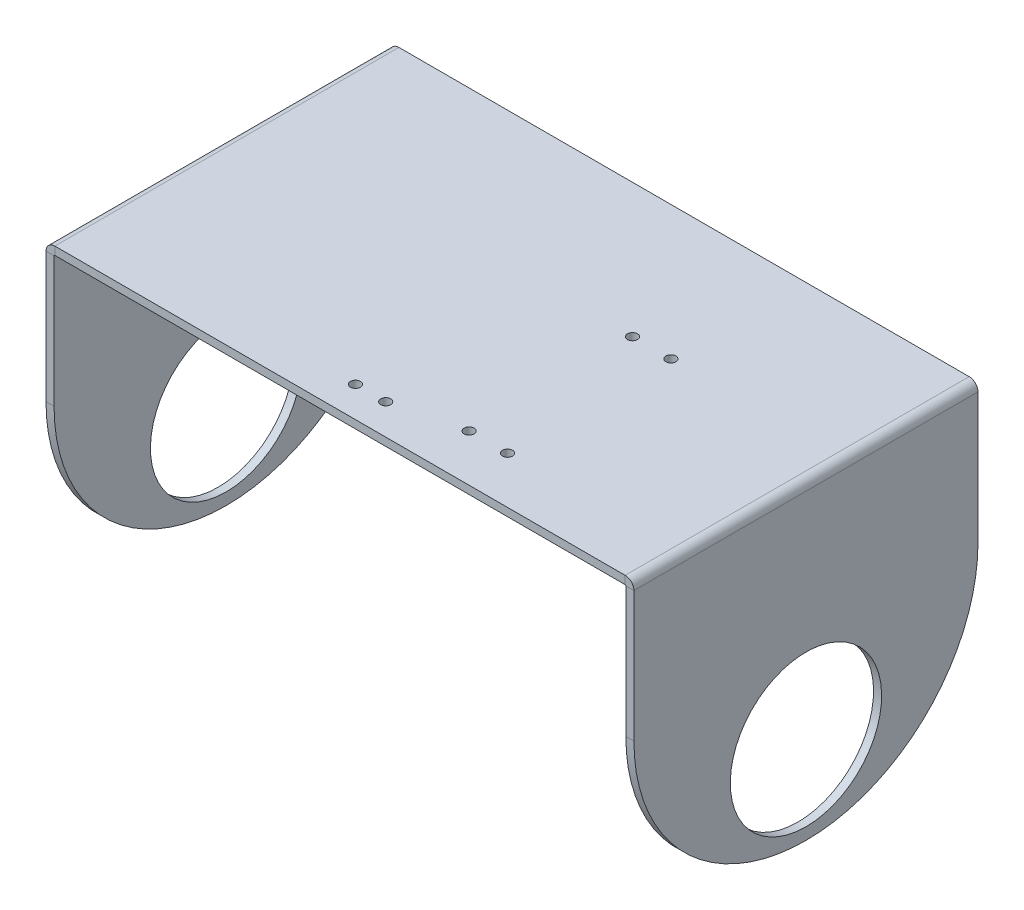
ISO-10303-21;
HEADER;
FILE_DESCRIPTION(('STEP AP214'),'2;1');
FILE_NAME('part.step','',(''),(''),'','','');
FILE_SCHEMA(('AUTOMOTIVE_DESIGN { 1 0 10303 214 1 1 1 1 }'));
ENDSEC;
DATA;
#1=APPLICATION_CONTEXT('core data for automotive mechanical design processes');
#2=APPLICATION_PROTOCOL_DEFINITION('international standard','automotive_design',2000,#1);
#3=PRODUCT_CONTEXT('',#1,'mechanical');
#4=PRODUCT('Part','Part','',(#3));
#5=PRODUCT_RELATED_PRODUCT_CATEGORY('part','',(#4));
#6=PRODUCT_DEFINITION_FORMATION('','',#4);
#7=PRODUCT_DEFINITION_CONTEXT('part definition',#1,'design');
#8=PRODUCT_DEFINITION('design','',#6,#7);
#9=PRODUCT_DEFINITION_SHAPE('','',#8);
#10=(LENGTH_UNIT() NAMED_UNIT(*) SI_UNIT(.MILLI.,.METRE.));
#11=(NAMED_UNIT(*) PLANE_ANGLE_UNIT() SI_UNIT($,.RADIAN.));
#12=(NAMED_UNIT(*) SI_UNIT($,.STERADIAN.) SOLID_ANGLE_UNIT());
#13=UNCERTAINTY_MEASURE_WITH_UNIT(LENGTH_MEASURE(1.E-05),#10,'distance_accuracy_value','');
#14=(GEOMETRIC_REPRESENTATION_CONTEXT(3) GLOBAL_UNCERTAINTY_ASSIGNED_CONTEXT((#13)) GLOBAL_UNIT_ASSIGNED_CONTEXT((#10,
#11,#12)) REPRESENTATION_CONTEXT('',''));
#15=CARTESIAN_POINT('',(0.,0.,0.));
#16=DIRECTION('',(0.,0.,1.));
#17=DIRECTION('',(1.,0.,0.));
#18=AXIS2_PLACEMENT_3D('',#15,#16,#17);
#19=CARTESIAN_POINT('',(0.,-8.,0.));
#20=DIRECTION('',(0.,-1.,0.));
#21=DIRECTION('',(0.,0.,-1.));
#22=AXIS2_PLACEMENT_3D('',#19,#20,#21);
#23=PLANE('',#22);
#24=CARTESIAN_POINT('',(410.94,-8.,-208.49));
#25=DIRECTION('',(0.,-1.,0.));
#26=DIRECTION('',(0.,0.,-1.));
#27=AXIS2_PLACEMENT_3D('',#24,#25,#26);
#28=CIRCLE('',#27,4.99999999999998);
#29=CARTESIAN_POINT('',(410.94,-8.,-213.49));
#30=VERTEX_POINT('',#29);
#31=EDGE_CURVE('E335',#30,#30,#28,.T.);
#32=ORIENTED_EDGE('',*,*,#31,.F.);
#33=EDGE_LOOP('',(#32));
#34=FACE_BOUND('',#33,.T.);
#35=CARTESIAN_POINT('',(372.86,-8.,-208.49));
#36=DIRECTION('',(0.,-1.,0.));
#37=DIRECTION('',(0.,0.,-1.));
#38=AXIS2_PLACEMENT_3D('',#35,#36,#37);
#39=CIRCLE('',#38,4.99999999999998);
#40=CARTESIAN_POINT('',(372.86,-8.,-213.49));
#41=VERTEX_POINT('',#40);
#42=EDGE_CURVE('E329',#41,#41,#39,.T.);
#43=ORIENTED_EDGE('',*,*,#42,.F.);
#44=EDGE_LOOP('',(#43));
#45=FACE_BOUND('',#44,.T.);
#46=CARTESIAN_POINT('',(372.86,-8.,-46.56));
#47=DIRECTION('',(0.,-1.,0.));
#48=DIRECTION('',(0.,0.,-1.));
#49=AXIS2_PLACEMENT_3D('',#46,#47,#48);
#50=CIRCLE('',#49,4.99999999999998);
#51=CARTESIAN_POINT('',(372.86,-8.,-51.56));
#52=VERTEX_POINT('',#51);
#53=EDGE_CURVE('E83',#52,#52,#50,.T.);
#54=ORIENTED_EDGE('',*,*,#53,.F.);
#55=EDGE_LOOP('',(#54));
#56=FACE_BOUND('',#55,.T.);
#57=CARTESIAN_POINT('',(410.94,-8.,-46.56));
#58=DIRECTION('',(0.,-1.,0.));
#59=DIRECTION('',(0.,0.,-1.));
#60=AXIS2_PLACEMENT_3D('',#57,#58,#59);
#61=CIRCLE('',#60,4.99999999999998);
#62=CARTESIAN_POINT('',(410.94,-8.,-51.56));
#63=VERTEX_POINT('',#62);
#64=EDGE_CURVE('E316',#63,#63,#61,.T.);
#65=ORIENTED_EDGE('',*,*,#64,.F.);
#66=EDGE_LOOP('',(#65));
#67=FACE_BOUND('',#66,.T.);
#68=CARTESIAN_POINT('',(306.4,-8.,-30.31));
#69=DIRECTION('',(0.,-1.,0.));
#70=DIRECTION('',(0.,0.,-1.));
#71=AXIS2_PLACEMENT_3D('',#68,#69,#70);
#72=CIRCLE('',#71,4.99999999999998);
#73=CARTESIAN_POINT('',(306.4,-8.,-35.31));
#74=VERTEX_POINT('',#73);
#75=EDGE_CURVE('E207',#74,#74,#72,.T.);
#76=ORIENTED_EDGE('',*,*,#75,.F.);
#77=EDGE_LOOP('',(#76));
#78=FACE_BOUND('',#77,.T.);
#79=CARTESIAN_POINT('',(276.4,-8.,-30.31));
#80=DIRECTION('',(0.,-1.,0.));
#81=DIRECTION('',(0.,0.,-1.));
#82=AXIS2_PLACEMENT_3D('',#79,#80,#81);
#83=CIRCLE('',#82,4.99999999999998);
#84=CARTESIAN_POINT('',(276.4,-8.,-35.31));
#85=VERTEX_POINT('',#84);
#86=EDGE_CURVE('E213',#85,#85,#83,.T.);
#87=ORIENTED_EDGE('',*,*,#86,.F.);
#88=EDGE_LOOP('',(#87));
#89=FACE_BOUND('',#88,.T.);
#90=DIRECTION('',(-1.,0.,0.));
#91=VECTOR('',#90,1.);
#92=CARTESIAN_POINT('',(0.,-8.,-341.07));
#93=LINE('',#92,#91);
#94=CARTESIAN_POINT('',(574.0634,-8.00000000000001,-341.07));
#95=VERTEX_POINT('',#94);
#96=CARTESIAN_POINT('',(8.7366,-8.,-341.07));
#97=VERTEX_POINT('',#96);
#98=EDGE_CURVE('E13',#95,#97,#93,.T.);
#99=ORIENTED_EDGE('',*,*,#98,.F.);
#100=DIRECTION('',(0.,0.,1.));
#101=VECTOR('',#100,1.);
#102=CARTESIAN_POINT('',(574.0634,-8.00000000000001,0.));
#103=LINE('',#102,#101);
#104=CARTESIAN_POINT('',(574.0634,-8.00000000000001,0.));
#105=VERTEX_POINT('',#104);
#106=EDGE_CURVE('E247',#105,#95,#103,.F.);
#107=ORIENTED_EDGE('',*,*,#106,.F.);
#108=DIRECTION('',(1.,0.,0.));
#109=VECTOR('',#108,1.);
#110=CARTESIAN_POINT('',(0.,-8.,0.));
#111=LINE('',#110,#109);
#112=CARTESIAN_POINT('',(8.7366,-8.,0.));
#113=VERTEX_POINT('',#112);
#114=EDGE_CURVE('E88',#113,#105,#111,.T.);
#115=ORIENTED_EDGE('',*,*,#114,.F.);
#116=DIRECTION('',(0.,0.,-1.));
#117=VECTOR('',#116,1.);
#118=CARTESIAN_POINT('',(8.7366,-8.,-341.07));
#119=LINE('',#118,#117);
#120=EDGE_CURVE('E296',#97,#113,#119,.F.);
#121=ORIENTED_EDGE('',*,*,#120,.F.);
#122=EDGE_LOOP('',(#99,#107,#115,#121));
#123=FACE_BOUND('',#122,.T.);
#124=ADVANCED_FACE('F79',(#34,#45,#56,#67,#78,#89,#123),#23,.T.);
#125=CARTESIAN_POINT('',(0.,0.,0.));
#126=DIRECTION('',(0.,-1.,0.));
#127=DIRECTION('',(0.,0.,-1.));
#128=AXIS2_PLACEMENT_3D('',#125,#126,#127);
#129=PLANE('',#128);
#130=CARTESIAN_POINT('',(410.94,0.,-208.49));
#131=DIRECTION('',(0.,1.,0.));
#132=DIRECTION('',(0.,0.,1.));
#133=AXIS2_PLACEMENT_3D('',#130,#131,#132);
#134=CIRCLE('',#133,5.);
#135=CARTESIAN_POINT('',(410.94,0.,-203.49));
#136=VERTEX_POINT('',#135);
#137=EDGE_CURVE('E338',#136,#136,#134,.T.);
#138=ORIENTED_EDGE('',*,*,#137,.F.);
#139=EDGE_LOOP('',(#138));
#140=FACE_BOUND('',#139,.T.);
#141=CARTESIAN_POINT('',(372.86,0.,-208.49));
#142=DIRECTION('',(0.,1.,0.));
#143=DIRECTION('',(0.,0.,1.));
#144=AXIS2_PLACEMENT_3D('',#141,#142,#143);
#145=CIRCLE('',#144,5.);
#146=CARTESIAN_POINT('',(372.86,0.,-203.49));
#147=VERTEX_POINT('',#146);
#148=EDGE_CURVE('E332',#147,#147,#145,.T.);
#149=ORIENTED_EDGE('',*,*,#148,.F.);
#150=EDGE_LOOP('',(#149));
#151=FACE_BOUND('',#150,.T.);
#152=CARTESIAN_POINT('',(372.86,0.,-46.56));
#153=DIRECTION('',(0.,1.,0.));
#154=DIRECTION('',(0.,0.,1.));
#155=AXIS2_PLACEMENT_3D('',#152,#153,#154);
#156=CIRCLE('',#155,5.);
#157=CARTESIAN_POINT('',(372.86,0.,-41.56));
#158=VERTEX_POINT('',#157);
#159=EDGE_CURVE('E326',#158,#158,#156,.T.);
#160=ORIENTED_EDGE('',*,*,#159,.F.);
#161=EDGE_LOOP('',(#160));
#162=FACE_BOUND('',#161,.T.);
#163=CARTESIAN_POINT('',(410.94,0.,-46.56));
#164=DIRECTION('',(0.,1.,0.));
#165=DIRECTION('',(0.,0.,1.));
#166=AXIS2_PLACEMENT_3D('',#163,#164,#165);
#167=CIRCLE('',#166,5.);
#168=CARTESIAN_POINT('',(410.94,0.,-41.56));
#169=VERTEX_POINT('',#168);
#170=EDGE_CURVE('E321',#169,#169,#167,.T.);
#171=ORIENTED_EDGE('',*,*,#170,.F.);
#172=EDGE_LOOP('',(#171));
#173=FACE_BOUND('',#172,.T.);
#174=CARTESIAN_POINT('',(306.4,0.,-30.31));
#175=DIRECTION('',(0.,1.,0.));
#176=DIRECTION('',(0.,0.,1.));
#177=AXIS2_PLACEMENT_3D('',#174,#175,#176);
#178=CIRCLE('',#177,5.);
#179=CARTESIAN_POINT('',(306.4,0.,-25.31));
#180=VERTEX_POINT('',#179);
#181=EDGE_CURVE('E199',#180,#180,#178,.T.);
#182=ORIENTED_EDGE('',*,*,#181,.F.);
#183=EDGE_LOOP('',(#182));
#184=FACE_BOUND('',#183,.T.);
#185=CARTESIAN_POINT('',(276.4,0.,-30.31));
#186=DIRECTION('',(0.,1.,0.));
#187=DIRECTION('',(0.,0.,1.));
#188=AXIS2_PLACEMENT_3D('',#185,#186,#187);
#189=CIRCLE('',#188,5.);
#190=CARTESIAN_POINT('',(276.4,0.,-25.31));
#191=VERTEX_POINT('',#190);
#192=EDGE_CURVE('E210',#191,#191,#189,.T.);
#193=ORIENTED_EDGE('',*,*,#192,.F.);
#194=EDGE_LOOP('',(#193));
#195=FACE_BOUND('',#194,.T.);
#196=DIRECTION('',(0.,0.,1.));
#197=VECTOR('',#196,1.);
#198=CARTESIAN_POINT('',(574.0634,0.,0.));
#199=LINE('',#198,#197);
#200=CARTESIAN_POINT('',(574.0634,0.,0.));
#201=VERTEX_POINT('',#200);
#202=CARTESIAN_POINT('',(574.0634,0.,-341.07));
#203=VERTEX_POINT('',#202);
#204=EDGE_CURVE('E235',#201,#203,#199,.F.);
#205=ORIENTED_EDGE('',*,*,#204,.T.);
#206=DIRECTION('',(-1.,0.,0.));
#207=VECTOR('',#206,1.);
#208=CARTESIAN_POINT('',(0.,0.,-341.07));
#209=LINE('',#208,#207);
#210=CARTESIAN_POINT('',(8.7366,0.,-341.07));
#211=VERTEX_POINT('',#210);
#212=EDGE_CURVE('E304',#203,#211,#209,.T.);
#213=ORIENTED_EDGE('',*,*,#212,.T.);
#214=DIRECTION('',(0.,0.,-1.));
#215=VECTOR('',#214,1.);
#216=CARTESIAN_POINT('',(8.7366,0.,-341.07));
#217=LINE('',#216,#215);
#218=CARTESIAN_POINT('',(8.7366,0.,0.));
#219=VERTEX_POINT('',#218);
#220=EDGE_CURVE('E284',#211,#219,#217,.F.);
#221=ORIENTED_EDGE('',*,*,#220,.T.);
#222=DIRECTION('',(1.,0.,0.));
#223=VECTOR('',#222,1.);
#224=CARTESIAN_POINT('',(0.,0.,0.));
#225=LINE('',#224,#223);
#226=EDGE_CURVE('E302',#219,#201,#225,.T.);
#227=ORIENTED_EDGE('',*,*,#226,.T.);
#228=EDGE_LOOP('',(#205,#213,#221,#227));
#229=FACE_BOUND('',#228,.T.);
#230=ADVANCED_FACE('F344',(#140,#151,#162,#173,#184,#195,#229),#129,.F.);
#231=CARTESIAN_POINT('',(0.,-8.,0.));
#232=DIRECTION('',(0.,0.,1.));
#233=DIRECTION('',(1.,0.,0.));
#234=AXIS2_PLACEMENT_3D('',#231,#232,#233);
#235=PLANE('',#234);
#236=ORIENTED_EDGE('',*,*,#114,.T.);
#237=DIRECTION('',(0.,1.,0.));
#238=VECTOR('',#237,1.);
#239=CARTESIAN_POINT('',(574.0634,-8.00000000000001,0.));
#240=LINE('',#239,#238);
#241=EDGE_CURVE('E241',#105,#201,#240,.T.);
#242=ORIENTED_EDGE('',*,*,#241,.T.);
#243=ORIENTED_EDGE('',*,*,#226,.F.);
#244=DIRECTION('',(0.,1.,0.));
#245=VECTOR('',#244,1.);
#246=CARTESIAN_POINT('',(8.7366,-8.,0.));
#247=LINE('',#246,#245);
#248=EDGE_CURVE('E96',#113,#219,#247,.T.);
#249=ORIENTED_EDGE('',*,*,#248,.F.);
#250=EDGE_LOOP('',(#236,#242,#243,#249));
#251=FACE_BOUND('',#250,.T.);
#252=ADVANCED_FACE('F81',(#251),#235,.T.);
#253=CARTESIAN_POINT('',(0.,-8.,-341.07));
#254=DIRECTION('',(0.,0.,-1.));
#255=DIRECTION('',(-1.,0.,0.));
#256=AXIS2_PLACEMENT_3D('',#253,#254,#255);
#257=PLANE('',#256);
#258=DIRECTION('',(0.,1.,0.));
#259=VECTOR('',#258,1.);
#260=CARTESIAN_POINT('',(574.0634,-8.00000000000001,-341.07));
#261=LINE('',#260,#259);
#262=EDGE_CURVE('E252',#95,#203,#261,.T.);
#263=ORIENTED_EDGE('',*,*,#262,.F.);
#264=ORIENTED_EDGE('',*,*,#98,.T.);
#265=DIRECTION('',(0.,1.,0.));
#266=VECTOR('',#265,1.);
#267=CARTESIAN_POINT('',(8.7366,-8.,-341.07));
#268=LINE('',#267,#266);
#269=EDGE_CURVE('E290',#97,#211,#268,.T.);
#270=ORIENTED_EDGE('',*,*,#269,.T.);
#271=ORIENTED_EDGE('',*,*,#212,.F.);
#272=EDGE_LOOP('',(#263,#264,#270,#271));
#273=FACE_BOUND('',#272,.T.);
#274=ADVANCED_FACE('F363',(#273),#257,.T.);
#275=CARTESIAN_POINT('',(8.7366,-8.7366,0.));
#276=DIRECTION('',(0.,0.,1.));
#277=DIRECTION('',(1.,0.,0.));
#278=AXIS2_PLACEMENT_3D('',#275,#276,#277);
#279=PLANE('',#278);
#280=DIRECTION('',(1.,0.,0.));
#281=VECTOR('',#280,1.);
#282=CARTESIAN_POINT('',(0.,-8.73659999999997,0.));
#283=LINE('',#282,#281);
#284=CARTESIAN_POINT('',(8.,-8.7366,0.));
#285=VERTEX_POINT('',#284);
#286=CARTESIAN_POINT('',(0.,-8.73659999999998,0.));
#287=VERTEX_POINT('',#286);
#288=EDGE_CURVE('E255',#285,#287,#283,.F.);
#289=ORIENTED_EDGE('',*,*,#288,.F.);
#290=CARTESIAN_POINT('',(8.7366,-8.7366,0.));
#291=DIRECTION('',(0.,0.,-1.));
#292=DIRECTION('',(-1.,0.,0.));
#293=AXIS2_PLACEMENT_3D('',#290,#291,#292);
#294=CIRCLE('',#293,0.736599999999999);
#295=EDGE_CURVE('E293',#113,#285,#294,.F.);
#296=ORIENTED_EDGE('',*,*,#295,.F.);
#297=ORIENTED_EDGE('',*,*,#248,.T.);
#298=CARTESIAN_POINT('',(8.7366,-8.7366,0.));
#299=DIRECTION('',(0.,0.,-1.));
#300=DIRECTION('',(-1.,0.,0.));
#301=AXIS2_PLACEMENT_3D('',#298,#299,#300);
#302=CIRCLE('',#301,8.7366);
#303=EDGE_CURVE('E286',#219,#287,#302,.F.);
#304=ORIENTED_EDGE('',*,*,#303,.T.);
#305=EDGE_LOOP('',(#289,#296,#297,#304));
#306=FACE_BOUND('',#305,.T.);
#307=ADVANCED_FACE('F386',(#306),#279,.T.);
#308=CARTESIAN_POINT('',(8.7366,-8.7366,-341.07));
#309=DIRECTION('',(0.,0.,1.));
#310=DIRECTION('',(1.,0.,0.));
#311=AXIS2_PLACEMENT_3D('',#308,#309,#310);
#312=PLANE('',#311);
#313=CARTESIAN_POINT('',(8.7366,-8.7366,-341.07));
#314=DIRECTION('',(0.,0.,-1.));
#315=DIRECTION('',(-1.,0.,0.));
#316=AXIS2_PLACEMENT_3D('',#313,#314,#315);
#317=CIRCLE('',#316,0.736599999999999);
#318=CARTESIAN_POINT('',(8.,-8.7366,-341.07));
#319=VERTEX_POINT('',#318);
#320=EDGE_CURVE('E261',#319,#97,#317,.T.);
#321=ORIENTED_EDGE('',*,*,#320,.F.);
#322=DIRECTION('',(1.,0.,0.));
#323=VECTOR('',#322,1.);
#324=CARTESIAN_POINT('',(8.,-8.7366,-341.07));
#325=LINE('',#324,#323);
#326=CARTESIAN_POINT('',(0.,-8.73659999999997,-341.07));
#327=VERTEX_POINT('',#326);
#328=EDGE_CURVE('E277',#319,#327,#325,.F.);
#329=ORIENTED_EDGE('',*,*,#328,.T.);
#330=CARTESIAN_POINT('',(8.7366,-8.7366,-341.07));
#331=DIRECTION('',(0.,0.,-1.));
#332=DIRECTION('',(-1.,0.,0.));
#333=AXIS2_PLACEMENT_3D('',#330,#331,#332);
#334=CIRCLE('',#333,8.7366);
#335=EDGE_CURVE('E287',#327,#211,#334,.T.);
#336=ORIENTED_EDGE('',*,*,#335,.T.);
#337=ORIENTED_EDGE('',*,*,#269,.F.);
#338=EDGE_LOOP('',(#321,#329,#336,#337));
#339=FACE_BOUND('',#338,.T.);
#340=ADVANCED_FACE('F431',(#339),#312,.F.);
#341=CARTESIAN_POINT('',(8.7366,-8.7366,-341.07));
#342=DIRECTION('',(0.,0.,-1.));
#343=DIRECTION('',(-1.,0.,0.));
#344=AXIS2_PLACEMENT_3D('',#341,#342,#343);
#345=CYLINDRICAL_SURFACE('',#344,8.7366);
#346=ORIENTED_EDGE('',*,*,#220,.F.);
#347=ORIENTED_EDGE('',*,*,#335,.F.);
#348=DIRECTION('',(0.,0.,-1.));
#349=VECTOR('',#348,1.);
#350=CARTESIAN_POINT('',(0.,-8.73659999999997,0.));
#351=LINE('',#350,#349);
#352=EDGE_CURVE('E275',#327,#287,#351,.F.);
#353=ORIENTED_EDGE('',*,*,#352,.T.);
#354=ORIENTED_EDGE('',*,*,#303,.F.);
#355=EDGE_LOOP('',(#346,#347,#353,#354));
#356=FACE_BOUND('',#355,.T.);
#357=ADVANCED_FACE('F388',(#356),#345,.T.);
#358=CARTESIAN_POINT('',(8.7366,-8.7366,-341.07));
#359=DIRECTION('',(0.,0.,-1.));
#360=DIRECTION('',(-1.,0.,0.));
#361=AXIS2_PLACEMENT_3D('',#358,#359,#360);
#362=CYLINDRICAL_SURFACE('',#361,0.736599999999999);
#363=ORIENTED_EDGE('',*,*,#120,.T.);
#364=ORIENTED_EDGE('',*,*,#295,.T.);
#365=DIRECTION('',(0.,0.,-1.));
#366=VECTOR('',#365,1.);
#367=CARTESIAN_POINT('',(8.,-8.7366,0.));
#368=LINE('',#367,#366);
#369=EDGE_CURVE('E280',#285,#319,#368,.T.);
#370=ORIENTED_EDGE('',*,*,#369,.T.);
#371=ORIENTED_EDGE('',*,*,#320,.T.);
#372=EDGE_LOOP('',(#363,#364,#370,#371));
#373=FACE_BOUND('',#372,.T.);
#374=ADVANCED_FACE('F407',(#373),#362,.F.);
#375=CARTESIAN_POINT('',(-4.54497550705923E-13,-138.,-341.07));
#376=DIRECTION('',(0.,0.,1.));
#377=DIRECTION('',(1.,0.,0.));
#378=AXIS2_PLACEMENT_3D('',#375,#376,#377);
#379=PLANE('',#378);
#380=ORIENTED_EDGE('',*,*,#328,.F.);
#381=DIRECTION('',(0.,1.,0.));
#382=VECTOR('',#381,1.);
#383=CARTESIAN_POINT('',(7.99999999999955,-138.,-341.07));
#384=LINE('',#383,#382);
#385=CARTESIAN_POINT('',(7.99999999999955,-138.,-341.07));
#386=VERTEX_POINT('',#385);
#387=EDGE_CURVE('E273',#319,#386,#384,.F.);
#388=ORIENTED_EDGE('',*,*,#387,.T.);
#389=DIRECTION('',(1.,0.,0.));
#390=VECTOR('',#389,1.);
#391=CARTESIAN_POINT('',(-4.54497550705923E-13,-138.,-341.07));
#392=LINE('',#391,#390);
#393=CARTESIAN_POINT('',(-4.54068849144724E-13,-138.,-341.07));
#394=VERTEX_POINT('',#393);
#395=EDGE_CURVE('E258',#394,#386,#392,.T.);
#396=ORIENTED_EDGE('',*,*,#395,.F.);
#397=DIRECTION('',(0.,-1.,0.));
#398=VECTOR('',#397,1.);
#399=CARTESIAN_POINT('',(0.,0.,-341.07));
#400=LINE('',#399,#398);
#401=EDGE_CURVE('E268',#327,#394,#400,.T.);
#402=ORIENTED_EDGE('',*,*,#401,.F.);
#403=EDGE_LOOP('',(#380,#388,#396,#402));
#404=FACE_BOUND('',#403,.T.);
#405=ADVANCED_FACE('F396',(#404),#379,.F.);
#406=CARTESIAN_POINT('',(0.,-7.99999999999997,0.));
#407=DIRECTION('',(0.,0.,-1.));
#408=DIRECTION('',(-1.,0.,0.));
#409=AXIS2_PLACEMENT_3D('',#406,#407,#408);
#410=PLANE('',#409);
#411=ORIENTED_EDGE('',*,*,#288,.T.);
#412=DIRECTION('',(0.,1.,0.));
#413=VECTOR('',#412,1.);
#414=CARTESIAN_POINT('',(0.,0.,0.));
#415=LINE('',#414,#413);
#416=CARTESIAN_POINT('',(-4.54068849144724E-13,-138.,0.));
#417=VERTEX_POINT('',#416);
#418=EDGE_CURVE('E265',#417,#287,#415,.T.);
#419=ORIENTED_EDGE('',*,*,#418,.F.);
#420=DIRECTION('',(1.,0.,0.));
#421=VECTOR('',#420,1.);
#422=CARTESIAN_POINT('',(-4.53892574049608E-13,-138.,0.));
#423=LINE('',#422,#421);
#424=CARTESIAN_POINT('',(7.99999999999955,-138.,0.));
#425=VERTEX_POINT('',#424);
#426=EDGE_CURVE('E262',#417,#425,#423,.T.);
#427=ORIENTED_EDGE('',*,*,#426,.T.);
#428=DIRECTION('',(0.,-1.,0.));
#429=VECTOR('',#428,1.);
#430=CARTESIAN_POINT('',(8.,-8.,0.));
#431=LINE('',#430,#429);
#432=EDGE_CURVE('E270',#425,#285,#431,.F.);
#433=ORIENTED_EDGE('',*,*,#432,.T.);
#434=EDGE_LOOP('',(#411,#419,#427,#433));
#435=FACE_BOUND('',#434,.T.);
#436=ADVANCED_FACE('F404',(#435),#410,.F.);
#437=CARTESIAN_POINT('',(0.,0.,0.));
#438=DIRECTION('',(1.,0.,0.));
#439=DIRECTION('',(0.,1.,0.));
#440=AXIS2_PLACEMENT_3D('',#437,#438,#439);
#441=PLANE('',#440);
#442=CARTESIAN_POINT('',(-7.7715611723761E-13,-221.773804427973,-170.535));
#443=DIRECTION('',(1.,0.,0.));
#444=DIRECTION('',(0.,1.,0.));
#445=AXIS2_PLACEMENT_3D('',#442,#443,#444);
#446=CIRCLE('',#445,75.);
#447=CARTESIAN_POINT('',(-9.99200722162641E-13,-296.773804427973,-170.535));
#448=VERTEX_POINT('',#447);
#449=EDGE_CURVE('E197',#448,#448,#446,.T.);
#450=ORIENTED_EDGE('',*,*,#449,.T.);
#451=EDGE_LOOP('',(#450));
#452=FACE_BOUND('',#451,.T.);
#453=ORIENTED_EDGE('',*,*,#352,.F.);
#454=ORIENTED_EDGE('',*,*,#401,.T.);
#455=CARTESIAN_POINT('',(-4.54497550705923E-13,-138.,-170.535));
#456=DIRECTION('',(-1.,0.,0.));
#457=DIRECTION('',(0.,-1.,0.));
#458=AXIS2_PLACEMENT_3D('',#455,#456,#457);
#459=CIRCLE('',#458,170.535);
#460=EDGE_CURVE('E217',#394,#417,#459,.T.);
#461=ORIENTED_EDGE('',*,*,#460,.T.);
#462=ORIENTED_EDGE('',*,*,#418,.T.);
#463=EDGE_LOOP('',(#453,#454,#461,#462));
#464=FACE_BOUND('',#463,.T.);
#465=ADVANCED_FACE('F392',(#452,#464),#441,.F.);
#466=CARTESIAN_POINT('',(8.00000000000003,0.,0.));
#467=DIRECTION('',(1.,0.,0.));
#468=DIRECTION('',(0.,1.,0.));
#469=AXIS2_PLACEMENT_3D('',#466,#467,#468);
#470=PLANE('',#469);
#471=CARTESIAN_POINT('',(7.99999999999923,-221.773804427973,-170.535));
#472=DIRECTION('',(1.,0.,0.));
#473=DIRECTION('',(0.,1.,0.));
#474=AXIS2_PLACEMENT_3D('',#471,#472,#473);
#475=CIRCLE('',#474,75.);
#476=CARTESIAN_POINT('',(7.99999999999901,-296.773804427973,-170.535));
#477=VERTEX_POINT('',#476);
#478=EDGE_CURVE('E202',#477,#477,#475,.T.);
#479=ORIENTED_EDGE('',*,*,#478,.F.);
#480=EDGE_LOOP('',(#479));
#481=FACE_BOUND('',#480,.T.);
#482=ORIENTED_EDGE('',*,*,#387,.F.);
#483=ORIENTED_EDGE('',*,*,#369,.F.);
#484=ORIENTED_EDGE('',*,*,#432,.F.);
#485=CARTESIAN_POINT('',(7.99999999999955,-138.,-170.535));
#486=DIRECTION('',(-1.,0.,0.));
#487=DIRECTION('',(0.,-1.,0.));
#488=AXIS2_PLACEMENT_3D('',#485,#486,#487);
#489=CIRCLE('',#488,170.535);
#490=EDGE_CURVE('E216',#386,#425,#489,.T.);
#491=ORIENTED_EDGE('',*,*,#490,.F.);
#492=EDGE_LOOP('',(#482,#483,#484,#491));
#493=FACE_BOUND('',#492,.T.);
#494=ADVANCED_FACE('F410',(#481,#493),#470,.T.);
#495=CARTESIAN_POINT('',(574.0634,-8.73659999999999,-341.07));
#496=DIRECTION('',(0.,0.,-1.));
#497=DIRECTION('',(-1.,0.,0.));
#498=AXIS2_PLACEMENT_3D('',#495,#496,#497);
#499=PLANE('',#498);
#500=DIRECTION('',(-1.,0.,0.));
#501=VECTOR('',#500,1.);
#502=CARTESIAN_POINT('',(582.8,-8.73659999999995,-341.07));
#503=LINE('',#502,#501);
#504=CARTESIAN_POINT('',(574.8,-8.73659999999998,-341.07));
#505=VERTEX_POINT('',#504);
#506=CARTESIAN_POINT('',(582.8,-8.73659999999997,-341.07));
#507=VERTEX_POINT('',#506);
#508=EDGE_CURVE('E220',#505,#507,#503,.F.);
#509=ORIENTED_EDGE('',*,*,#508,.F.);
#510=CARTESIAN_POINT('',(574.0634,-8.73659999999999,-341.07));
#511=DIRECTION('',(0.,0.,1.));
#512=DIRECTION('',(1.,0.,0.));
#513=AXIS2_PLACEMENT_3D('',#510,#511,#512);
#514=CIRCLE('',#513,0.736599999999976);
#515=EDGE_CURVE('E244',#95,#505,#514,.F.);
#516=ORIENTED_EDGE('',*,*,#515,.F.);
#517=ORIENTED_EDGE('',*,*,#262,.T.);
#518=CARTESIAN_POINT('',(574.0634,-8.73659999999999,-341.07));
#519=DIRECTION('',(0.,0.,1.));
#520=DIRECTION('',(1.,0.,0.));
#521=AXIS2_PLACEMENT_3D('',#518,#519,#520);
#522=CIRCLE('',#521,8.73659999999998);
#523=EDGE_CURVE('E237',#203,#507,#522,.F.);
#524=ORIENTED_EDGE('',*,*,#523,.T.);
#525=EDGE_LOOP('',(#509,#516,#517,#524));
#526=FACE_BOUND('',#525,.T.);
#527=ADVANCED_FACE('F367',(#526),#499,.T.);
#528=CARTESIAN_POINT('',(574.0634,-8.73659999999999,0.));
#529=DIRECTION('',(0.,0.,-1.));
#530=DIRECTION('',(-1.,0.,0.));
#531=AXIS2_PLACEMENT_3D('',#528,#529,#530);
#532=PLANE('',#531);
#533=CARTESIAN_POINT('',(574.0634,-8.73659999999999,0.));
#534=DIRECTION('',(0.,0.,1.));
#535=DIRECTION('',(1.,0.,0.));
#536=AXIS2_PLACEMENT_3D('',#533,#534,#535);
#537=CIRCLE('',#536,0.736599999999976);
#538=CARTESIAN_POINT('',(574.8,-8.73659999999998,0.));
#539=VERTEX_POINT('',#538);
#540=EDGE_CURVE('E223',#539,#105,#537,.T.);
#541=ORIENTED_EDGE('',*,*,#540,.F.);
#542=DIRECTION('',(-1.,0.,0.));
#543=VECTOR('',#542,1.);
#544=CARTESIAN_POINT('',(574.8,-8.73659999999998,0.));
#545=LINE('',#544,#543);
#546=CARTESIAN_POINT('',(582.8,-8.73659999999995,0.));
#547=VERTEX_POINT('',#546);
#548=EDGE_CURVE('E230',#539,#547,#545,.F.);
#549=ORIENTED_EDGE('',*,*,#548,.T.);
#550=CARTESIAN_POINT('',(574.0634,-8.73659999999999,0.));
#551=DIRECTION('',(0.,0.,1.));
#552=DIRECTION('',(1.,0.,0.));
#553=AXIS2_PLACEMENT_3D('',#550,#551,#552);
#554=CIRCLE('',#553,8.73659999999998);
#555=EDGE_CURVE('E238',#547,#201,#554,.T.);
#556=ORIENTED_EDGE('',*,*,#555,.T.);
#557=ORIENTED_EDGE('',*,*,#241,.F.);
#558=EDGE_LOOP('',(#541,#549,#556,#557));
#559=FACE_BOUND('',#558,.T.);
#560=ADVANCED_FACE('F378',(#559),#532,.F.);
#561=CARTESIAN_POINT('',(574.0634,-8.73659999999999,0.));
#562=DIRECTION('',(0.,0.,1.));
#563=DIRECTION('',(1.,0.,0.));
#564=AXIS2_PLACEMENT_3D('',#561,#562,#563);
#565=CYLINDRICAL_SURFACE('',#564,8.73659999999998);
#566=ORIENTED_EDGE('',*,*,#204,.F.);
#567=ORIENTED_EDGE('',*,*,#555,.F.);
#568=DIRECTION('',(0.,0.,1.));
#569=VECTOR('',#568,1.);
#570=CARTESIAN_POINT('',(582.8,-8.73659999999995,-341.07));
#571=LINE('',#570,#569);
#572=EDGE_CURVE('E228',#547,#507,#571,.F.);
#573=ORIENTED_EDGE('',*,*,#572,.T.);
#574=ORIENTED_EDGE('',*,*,#523,.F.);
#575=EDGE_LOOP('',(#566,#567,#573,#574));
#576=FACE_BOUND('',#575,.T.);
#577=ADVANCED_FACE('F368',(#576),#565,.T.);
#578=CARTESIAN_POINT('',(574.0634,-8.73659999999999,0.));
#579=DIRECTION('',(0.,0.,1.));
#580=DIRECTION('',(1.,0.,0.));
#581=AXIS2_PLACEMENT_3D('',#578,#579,#580);
#582=CYLINDRICAL_SURFACE('',#581,0.736599999999976);
#583=ORIENTED_EDGE('',*,*,#106,.T.);
#584=ORIENTED_EDGE('',*,*,#515,.T.);
#585=DIRECTION('',(0.,0.,1.));
#586=VECTOR('',#585,1.);
#587=CARTESIAN_POINT('',(574.8,-8.73659999999998,-341.07));
#588=LINE('',#587,#586);
#589=EDGE_CURVE('E177',#505,#539,#588,.T.);
#590=ORIENTED_EDGE('',*,*,#589,.T.);
#591=ORIENTED_EDGE('',*,*,#540,.T.);
#592=EDGE_LOOP('',(#583,#584,#590,#591));
#593=FACE_BOUND('',#592,.T.);
#594=ADVANCED_FACE('F381',(#593),#582,.F.);
#595=CARTESIAN_POINT('',(582.8,-138.,0.));
#596=DIRECTION('',(0.,0.,-1.));
#597=DIRECTION('',(-1.,0.,0.));
#598=AXIS2_PLACEMENT_3D('',#595,#596,#597);
#599=PLANE('',#598);
#600=ORIENTED_EDGE('',*,*,#548,.F.);
#601=DIRECTION('',(0.,1.,0.));
#602=VECTOR('',#601,1.);
#603=CARTESIAN_POINT('',(574.8,-138.,0.));
#604=LINE('',#603,#602);
#605=CARTESIAN_POINT('',(574.8,-138.,0.));
#606=VERTEX_POINT('',#605);
#607=EDGE_CURVE('E181',#539,#606,#604,.F.);
#608=ORIENTED_EDGE('',*,*,#607,.T.);
#609=DIRECTION('',(-1.,0.,0.));
#610=VECTOR('',#609,1.);
#611=CARTESIAN_POINT('',(582.8,-138.,0.));
#612=LINE('',#611,#610);
#613=CARTESIAN_POINT('',(582.8,-138.,0.));
#614=VERTEX_POINT('',#613);
#615=EDGE_CURVE('E191',#614,#606,#612,.T.);
#616=ORIENTED_EDGE('',*,*,#615,.F.);
#617=DIRECTION('',(0.,-1.,0.));
#618=VECTOR('',#617,1.);
#619=CARTESIAN_POINT('',(582.8,2.01881793917703E-12,0.));
#620=LINE('',#619,#618);
#621=EDGE_CURVE('E180',#547,#614,#620,.T.);
#622=ORIENTED_EDGE('',*,*,#621,.F.);
#623=EDGE_LOOP('',(#600,#608,#616,#622));
#624=FACE_BOUND('',#623,.T.);
#625=ADVANCED_FACE('F375',(#624),#599,.F.);
#626=CARTESIAN_POINT('',(582.8,-7.99999999999997,-341.07));
#627=DIRECTION('',(0.,0.,1.));
#628=DIRECTION('',(1.,0.,0.));
#629=AXIS2_PLACEMENT_3D('',#626,#627,#628);
#630=PLANE('',#629);
#631=ORIENTED_EDGE('',*,*,#508,.T.);
#632=DIRECTION('',(0.,1.,0.));
#633=VECTOR('',#632,1.);
#634=CARTESIAN_POINT('',(582.8,2.01881793917703E-12,-341.07));
#635=LINE('',#634,#633);
#636=CARTESIAN_POINT('',(582.8,-138.,-341.07));
#637=VERTEX_POINT('',#636);
#638=EDGE_CURVE('E187',#637,#507,#635,.T.);
#639=ORIENTED_EDGE('',*,*,#638,.F.);
#640=DIRECTION('',(-1.,0.,0.));
#641=VECTOR('',#640,1.);
#642=CARTESIAN_POINT('',(582.8,-138.,-341.07));
#643=LINE('',#642,#641);
#644=CARTESIAN_POINT('',(574.8,-138.,-341.07));
#645=VERTEX_POINT('',#644);
#646=EDGE_CURVE('E184',#637,#645,#643,.T.);
#647=ORIENTED_EDGE('',*,*,#646,.T.);
#648=DIRECTION('',(0.,-1.,0.));
#649=VECTOR('',#648,1.);
#650=CARTESIAN_POINT('',(574.8,-8.,-341.07));
#651=LINE('',#650,#649);
#652=EDGE_CURVE('E171',#645,#505,#651,.F.);
#653=ORIENTED_EDGE('',*,*,#652,.T.);
#654=EDGE_LOOP('',(#631,#639,#647,#653));
#655=FACE_BOUND('',#654,.T.);
#656=ADVANCED_FACE('F185',(#655),#630,.F.);
#657=CARTESIAN_POINT('',(582.8,2.01881793917703E-12,0.));
#658=DIRECTION('',(-1.,0.,0.));
#659=DIRECTION('',(0.,-1.,0.));
#660=AXIS2_PLACEMENT_3D('',#657,#658,#659);
#661=PLANE('',#660);
#662=CARTESIAN_POINT('',(582.800000000001,-221.773804427975,-170.535));
#663=DIRECTION('',(-1.,0.,0.));
#664=DIRECTION('',(0.,-1.,0.));
#665=AXIS2_PLACEMENT_3D('',#662,#663,#664);
#666=CIRCLE('',#665,75.);
#667=CARTESIAN_POINT('',(582.8,-296.773804427975,-170.535));
#668=VERTEX_POINT('',#667);
#669=EDGE_CURVE('E310',#668,#668,#666,.T.);
#670=ORIENTED_EDGE('',*,*,#669,.T.);
#671=EDGE_LOOP('',(#670));
#672=FACE_BOUND('',#671,.T.);
#673=ORIENTED_EDGE('',*,*,#572,.F.);
#674=ORIENTED_EDGE('',*,*,#621,.T.);
#675=CARTESIAN_POINT('',(582.8,-137.999999999998,-170.535));
#676=DIRECTION('',(1.,0.,0.));
#677=DIRECTION('',(0.,1.,0.));
#678=AXIS2_PLACEMENT_3D('',#675,#676,#677);
#679=CIRCLE('',#678,170.535);
#680=EDGE_CURVE('E196',#614,#637,#679,.T.);
#681=ORIENTED_EDGE('',*,*,#680,.T.);
#682=ORIENTED_EDGE('',*,*,#638,.T.);
#683=EDGE_LOOP('',(#673,#674,#681,#682));
#684=FACE_BOUND('',#683,.T.);
#685=ADVANCED_FACE('F372',(#672,#684),#661,.F.);
#686=CARTESIAN_POINT('',(574.8,1.99088608846628E-12,0.));
#687=DIRECTION('',(-1.,0.,0.));
#688=DIRECTION('',(0.,-1.,0.));
#689=AXIS2_PLACEMENT_3D('',#686,#687,#688);
#690=PLANE('',#689);
#691=CARTESIAN_POINT('',(574.800000000001,-221.773804427975,-170.535));
#692=DIRECTION('',(-1.,0.,0.));
#693=DIRECTION('',(0.,-1.,0.));
#694=AXIS2_PLACEMENT_3D('',#691,#692,#693);
#695=CIRCLE('',#694,75.);
#696=CARTESIAN_POINT('',(574.800000000001,-296.773804427975,-170.535));
#697=VERTEX_POINT('',#696);
#698=EDGE_CURVE('E308',#697,#697,#695,.T.);
#699=ORIENTED_EDGE('',*,*,#698,.F.);
#700=EDGE_LOOP('',(#699));
#701=FACE_BOUND('',#700,.T.);
#702=ORIENTED_EDGE('',*,*,#607,.F.);
#703=ORIENTED_EDGE('',*,*,#589,.F.);
#704=ORIENTED_EDGE('',*,*,#652,.F.);
#705=CARTESIAN_POINT('',(574.8,-137.999999999998,-170.535));
#706=DIRECTION('',(1.,0.,0.));
#707=DIRECTION('',(0.,1.,0.));
#708=AXIS2_PLACEMENT_3D('',#705,#706,#707);
#709=CIRCLE('',#708,170.535);
#710=EDGE_CURVE('E176',#606,#645,#709,.T.);
#711=ORIENTED_EDGE('',*,*,#710,.F.);
#712=EDGE_LOOP('',(#702,#703,#704,#711));
#713=FACE_BOUND('',#712,.T.);
#714=ADVANCED_FACE('F174',(#701,#713),#690,.T.);
#715=CARTESIAN_POINT('',(-4.54497550705923E-13,-138.,-170.535));
#716=DIRECTION('',(1.,0.,0.));
#717=DIRECTION('',(0.,1.,0.));
#718=AXIS2_PLACEMENT_3D('',#715,#716,#717);
#719=CYLINDRICAL_SURFACE('',#718,170.535);
#720=ORIENTED_EDGE('',*,*,#490,.T.);
#721=ORIENTED_EDGE('',*,*,#426,.F.);
#722=ORIENTED_EDGE('',*,*,#460,.F.);
#723=ORIENTED_EDGE('',*,*,#395,.T.);
#724=EDGE_LOOP('',(#720,#721,#722,#723));
#725=FACE_BOUND('',#724,.T.);
#726=ADVANCED_FACE('F402',(#725),#719,.T.);
#727=CARTESIAN_POINT('',(276.4,0.,-30.31));
#728=DIRECTION('',(0.,1.,0.));
#729=DIRECTION('',(0.,0.,1.));
#730=AXIS2_PLACEMENT_3D('',#727,#728,#729);
#731=CYLINDRICAL_SURFACE('',#730,4.99999999999998);
#732=ORIENTED_EDGE('',*,*,#86,.T.);
#733=EDGE_LOOP('',(#732));
#734=FACE_BOUND('',#733,.T.);
#735=ORIENTED_EDGE('',*,*,#192,.T.);
#736=EDGE_LOOP('',(#735));
#737=FACE_BOUND('',#736,.T.);
#738=ADVANCED_FACE('F491',(#734,#737),#731,.F.);
#739=CARTESIAN_POINT('',(306.4,0.,-30.31));
#740=DIRECTION('',(0.,1.,0.));
#741=DIRECTION('',(0.,0.,1.));
#742=AXIS2_PLACEMENT_3D('',#739,#740,#741);
#743=CYLINDRICAL_SURFACE('',#742,4.99999999999998);
#744=ORIENTED_EDGE('',*,*,#75,.T.);
#745=EDGE_LOOP('',(#744));
#746=FACE_BOUND('',#745,.T.);
#747=ORIENTED_EDGE('',*,*,#181,.T.);
#748=EDGE_LOOP('',(#747));
#749=FACE_BOUND('',#748,.T.);
#750=ADVANCED_FACE('F488',(#746,#749),#743,.F.);
#751=CARTESIAN_POINT('',(582.8,-137.999999999998,-170.535));
#752=DIRECTION('',(-1.,0.,0.));
#753=DIRECTION('',(0.,-1.,0.));
#754=AXIS2_PLACEMENT_3D('',#751,#752,#753);
#755=CYLINDRICAL_SURFACE('',#754,170.535);
#756=ORIENTED_EDGE('',*,*,#710,.T.);
#757=ORIENTED_EDGE('',*,*,#646,.F.);
#758=ORIENTED_EDGE('',*,*,#680,.F.);
#759=ORIENTED_EDGE('',*,*,#615,.T.);
#760=EDGE_LOOP('',(#756,#757,#758,#759));
#761=FACE_BOUND('',#760,.T.);
#762=ADVANCED_FACE('F194',(#761),#755,.T.);
#763=CARTESIAN_POINT('',(582.800000000001,-221.773804427975,-170.535));
#764=DIRECTION('',(-1.,0.,0.));
#765=DIRECTION('',(0.,-1.,0.));
#766=AXIS2_PLACEMENT_3D('',#763,#764,#765);
#767=CYLINDRICAL_SURFACE('',#766,75.);
#768=CARTESIAN_POINT('',(574.800000000001,-296.773804427975,-170.535));
#769=CARTESIAN_POINT('',(574.883333333334,-296.773804427975,-170.535));
#770=CARTESIAN_POINT('',(574.966666666668,-296.773804427975,-170.535));
#771=CARTESIAN_POINT('',(575.133333333334,-296.773804427975,-170.535));
#772=CARTESIAN_POINT('',(575.216666666668,-296.773804427975,-170.535));
#773=CARTESIAN_POINT('',(575.383333333334,-296.773804427975,-170.535));
#774=CARTESIAN_POINT('',(575.466666666668,-296.773804427975,-170.535));
#775=CARTESIAN_POINT('',(575.633333333334,-296.773804427975,-170.535));
#776=CARTESIAN_POINT('',(575.716666666668,-296.773804427975,-170.535));
#777=CARTESIAN_POINT('',(575.883333333334,-296.773804427975,-170.535));
#778=CARTESIAN_POINT('',(575.966666666668,-296.773804427975,-170.535));
#779=CARTESIAN_POINT('',(576.133333333334,-296.773804427975,-170.535));
#780=CARTESIAN_POINT('',(576.216666666668,-296.773804427975,-170.535));
#781=CARTESIAN_POINT('',(576.383333333334,-296.773804427975,-170.535));
#782=CARTESIAN_POINT('',(576.466666666668,-296.773804427975,-170.535));
#783=CARTESIAN_POINT('',(576.633333333334,-296.773804427975,-170.535));
#784=CARTESIAN_POINT('',(576.716666666667,-296.773804427975,-170.535));
#785=CARTESIAN_POINT('',(576.883333333334,-296.773804427975,-170.535));
#786=CARTESIAN_POINT('',(576.966666666667,-296.773804427975,-170.535));
#787=CARTESIAN_POINT('',(577.133333333334,-296.773804427975,-170.535));
#788=CARTESIAN_POINT('',(577.216666666667,-296.773804427975,-170.535));
#789=CARTESIAN_POINT('',(577.383333333334,-296.773804427975,-170.535));
#790=CARTESIAN_POINT('',(577.466666666667,-296.773804427975,-170.535));
#791=CARTESIAN_POINT('',(577.633333333334,-296.773804427975,-170.535));
#792=CARTESIAN_POINT('',(577.716666666667,-296.773804427975,-170.535));
#793=CARTESIAN_POINT('',(577.883333333334,-296.773804427975,-170.535));
#794=CARTESIAN_POINT('',(577.966666666667,-296.773804427975,-170.535));
#795=CARTESIAN_POINT('',(578.133333333334,-296.773804427975,-170.535));
#796=CARTESIAN_POINT('',(578.216666666667,-296.773804427975,-170.535));
#797=CARTESIAN_POINT('',(578.383333333334,-296.773804427975,-170.535));
#798=CARTESIAN_POINT('',(578.466666666667,-296.773804427975,-170.535));
#799=CARTESIAN_POINT('',(578.633333333334,-296.773804427975,-170.535));
#800=CARTESIAN_POINT('',(578.716666666667,-296.773804427975,-170.535));
#801=CARTESIAN_POINT('',(578.883333333334,-296.773804427975,-170.535));
#802=CARTESIAN_POINT('',(578.966666666667,-296.773804427975,-170.535));
#803=CARTESIAN_POINT('',(579.133333333334,-296.773804427975,-170.535));
#804=CARTESIAN_POINT('',(579.216666666667,-296.773804427975,-170.535));
#805=CARTESIAN_POINT('',(579.383333333334,-296.773804427975,-170.535));
#806=CARTESIAN_POINT('',(579.466666666667,-296.773804427975,-170.535));
#807=CARTESIAN_POINT('',(579.633333333334,-296.773804427975,-170.535));
#808=CARTESIAN_POINT('',(579.716666666667,-296.773804427975,-170.535));
#809=CARTESIAN_POINT('',(579.883333333334,-296.773804427975,-170.535));
#810=CARTESIAN_POINT('',(579.966666666667,-296.773804427975,-170.535));
#811=CARTESIAN_POINT('',(580.133333333334,-296.773804427975,-170.535));
#812=CARTESIAN_POINT('',(580.216666666667,-296.773804427975,-170.535));
#813=CARTESIAN_POINT('',(580.383333333334,-296.773804427975,-170.535));
#814=CARTESIAN_POINT('',(580.466666666667,-296.773804427975,-170.535));
#815=CARTESIAN_POINT('',(580.633333333334,-296.773804427975,-170.535));
#816=CARTESIAN_POINT('',(580.716666666667,-296.773804427975,-170.535));
#817=CARTESIAN_POINT('',(580.883333333334,-296.773804427975,-170.535));
#818=CARTESIAN_POINT('',(580.966666666667,-296.773804427975,-170.535));
#819=CARTESIAN_POINT('',(581.133333333334,-296.773804427975,-170.535));
#820=CARTESIAN_POINT('',(581.216666666667,-296.773804427975,-170.535));
#821=CARTESIAN_POINT('',(581.383333333334,-296.773804427975,-170.535));
#822=CARTESIAN_POINT('',(581.466666666667,-296.773804427975,-170.535));
#823=CARTESIAN_POINT('',(581.633333333334,-296.773804427975,-170.535));
#824=CARTESIAN_POINT('',(581.716666666667,-296.773804427975,-170.535));
#825=CARTESIAN_POINT('',(581.883333333334,-296.773804427975,-170.535));
#826=CARTESIAN_POINT('',(581.966666666667,-296.773804427975,-170.535));
#827=CARTESIAN_POINT('',(582.133333333334,-296.773804427975,-170.535));
#828=CARTESIAN_POINT('',(582.216666666667,-296.773804427975,-170.535));
#829=CARTESIAN_POINT('',(582.383333333334,-296.773804427975,-170.535));
#830=CARTESIAN_POINT('',(582.466666666667,-296.773804427975,-170.535));
#831=CARTESIAN_POINT('',(582.633333333334,-296.773804427975,-170.535));
#832=CARTESIAN_POINT('',(582.716666666667,-296.773804427975,-170.535));
#833=CARTESIAN_POINT('',(582.8,-296.773804427975,-170.535));
#834=B_SPLINE_CURVE_WITH_KNOTS('',3,(#768,#769,#770,#771,#772,#773,#774,#775,#776,#777,#778,
#779,#780,#781,#782,#783,#784,#785,#786,#787,#788,#789,#790,#791,#792,#793,#794,#795,#796,#797,
#798,#799,#800,#801,#802,#803,#804,#805,#806,#807,#808,#809,#810,#811,#812,#813,#814,#815,#816,
#817,#818,#819,#820,#821,#822,#823,#824,#825,#826,#827,#828,#829,#830,#831,#832,#833),
.UNSPECIFIED.,.F.,.F.,(4,2,2,2,2,2,2,2,2,2,2,2,2,2,2,2,2,2,2,2,2,2,2,2,2,2,2,2,2,2,2,2,4),(0.,
0.250000000000083,0.500000000000056,0.750000000000028,1.,1.24999999999997,1.49999999999995,
1.74999999999992,1.99999999999989,2.24999999999986,2.49999999999984,2.74999999999981,
2.99999999999978,3.24999999999975,3.49999999999973,3.7499999999997,3.99999999999967,
4.24999999999975,4.49999999999973,4.7499999999997,4.99999999999967,5.24999999999964,
5.49999999999962,5.74999999999959,5.99999999999956,6.24999999999953,6.49999999999951,
6.74999999999948,6.99999999999945,7.24999999999942,7.4999999999994,7.74999999999937,
7.99999999999945),.UNSPECIFIED.);
#835=EDGE_CURVE('BSEAM483',#697,#668,#834,.T.);
#836=ORIENTED_EDGE('',*,*,#698,.T.);
#837=ORIENTED_EDGE('',*,*,#669,.F.);
#838=ORIENTED_EDGE('',*,*,#835,.T.);
#839=ORIENTED_EDGE('',*,*,#835,.F.);
#840=EDGE_LOOP('',(#836,#838,#837,#839));
#841=FACE_BOUND('',#840,.T.);
#842=ADVANCED_FACE('F483',(#841),#767,.F.);
#843=CARTESIAN_POINT('',(7.99999999999901,-296.773804427973,-170.535));
#844=CARTESIAN_POINT('',(7.91666666666568,-296.773804427973,-170.535));
#845=CARTESIAN_POINT('',(7.83333333333236,-296.773804427973,-170.535));
#846=CARTESIAN_POINT('',(7.66666666666571,-296.773804427973,-170.535));
#847=CARTESIAN_POINT('',(7.58333333333239,-296.773804427973,-170.535));
#848=CARTESIAN_POINT('',(7.4166666666657,-296.773804427973,-170.535));
#849=CARTESIAN_POINT('',(7.33333333333234,-296.773804427973,-170.535));
#850=CARTESIAN_POINT('',(7.16666666666566,-296.773804427973,-170.535));
#851=CARTESIAN_POINT('',(7.08333333333233,-296.773804427973,-170.535));
#852=CARTESIAN_POINT('',(6.91666666666568,-296.773804427973,-170.535));
#853=CARTESIAN_POINT('',(6.83333333333236,-296.773804427973,-170.535));
#854=CARTESIAN_POINT('',(6.66666666666567,-296.773804427973,-170.535));
#855=CARTESIAN_POINT('',(6.58333333333231,-296.773804427973,-170.535));
#856=CARTESIAN_POINT('',(6.41666666666563,-296.773804427973,-170.535));
#857=CARTESIAN_POINT('',(6.3333333333323,-296.773804427973,-170.535));
#858=CARTESIAN_POINT('',(6.16666666666565,-296.773804427973,-170.535));
#859=CARTESIAN_POINT('',(6.08333333333233,-296.773804427973,-170.535));
#860=CARTESIAN_POINT('',(5.91666666666568,-296.773804427973,-170.535));
#861=CARTESIAN_POINT('',(5.83333333333236,-296.773804427973,-170.535));
#862=CARTESIAN_POINT('',(5.66666666666571,-296.773804427973,-170.535));
#863=CARTESIAN_POINT('',(5.58333333333239,-296.773804427973,-170.535));
#864=CARTESIAN_POINT('',(5.4166666666657,-296.773804427973,-170.535));
#865=CARTESIAN_POINT('',(5.33333333333234,-296.773804427973,-170.535));
#866=CARTESIAN_POINT('',(5.16666666666565,-296.773804427973,-170.535));
#867=CARTESIAN_POINT('',(5.08333333333233,-296.773804427973,-170.535));
#868=CARTESIAN_POINT('',(4.91666666666568,-296.773804427973,-170.535));
#869=CARTESIAN_POINT('',(4.83333333333236,-296.773804427973,-170.535));
#870=CARTESIAN_POINT('',(4.66666666666567,-296.773804427973,-170.535));
#871=CARTESIAN_POINT('',(4.58333333333231,-296.773804427973,-170.535));
#872=CARTESIAN_POINT('',(4.41666666666563,-296.773804427973,-170.535));
#873=CARTESIAN_POINT('',(4.3333333333323,-296.773804427973,-170.535));
#874=CARTESIAN_POINT('',(4.16666666666565,-296.773804427973,-170.535));
#875=CARTESIAN_POINT('',(4.08333333333233,-296.773804427973,-170.535));
#876=CARTESIAN_POINT('',(3.91666666666568,-296.773804427973,-170.535));
#877=CARTESIAN_POINT('',(3.83333333333236,-296.773804427973,-170.535));
#878=CARTESIAN_POINT('',(3.66666666666571,-296.773804427973,-170.535));
#879=CARTESIAN_POINT('',(3.58333333333238,-296.773804427973,-170.535));
#880=CARTESIAN_POINT('',(3.4166666666657,-296.773804427973,-170.535));
#881=CARTESIAN_POINT('',(3.33333333333234,-296.773804427973,-170.535));
#882=CARTESIAN_POINT('',(3.16666666666565,-296.773804427973,-170.535));
#883=CARTESIAN_POINT('',(3.08333333333233,-296.773804427973,-170.535));
#884=CARTESIAN_POINT('',(2.91666666666568,-296.773804427973,-170.535));
#885=CARTESIAN_POINT('',(2.83333333333236,-296.773804427973,-170.535));
#886=CARTESIAN_POINT('',(2.66666666666567,-296.773804427973,-170.535));
#887=CARTESIAN_POINT('',(2.58333333333231,-296.773804427973,-170.535));
#888=CARTESIAN_POINT('',(2.41666666666562,-296.773804427973,-170.535));
#889=CARTESIAN_POINT('',(2.3333333333323,-296.773804427973,-170.535));
#890=CARTESIAN_POINT('',(2.16666666666565,-296.773804427973,-170.535));
#891=CARTESIAN_POINT('',(2.08333333333233,-296.773804427973,-170.535));
#892=CARTESIAN_POINT('',(1.91666666666568,-296.773804427973,-170.535));
#893=CARTESIAN_POINT('',(1.83333333333235,-296.773804427973,-170.535));
#894=CARTESIAN_POINT('',(1.66666666666571,-296.773804427973,-170.535));
#895=CARTESIAN_POINT('',(1.58333333333238,-296.773804427973,-170.535));
#896=CARTESIAN_POINT('',(1.4166666666657,-296.773804427973,-170.535));
#897=CARTESIAN_POINT('',(1.33333333333234,-296.773804427973,-170.535));
#898=CARTESIAN_POINT('',(1.16666666666565,-296.773804427973,-170.535));
#899=CARTESIAN_POINT('',(1.08333333333233,-296.773804427973,-170.535));
#900=CARTESIAN_POINT('',(0.916666666665678,-296.773804427973,-170.535));
#901=CARTESIAN_POINT('',(0.833333333332353,-296.773804427973,-170.535));
#902=CARTESIAN_POINT('',(0.666666666665668,-296.773804427973,-170.535));
#903=CARTESIAN_POINT('',(0.583333333332307,-296.773804427973,-170.535));
#904=CARTESIAN_POINT('',(0.416666666665622,-296.773804427973,-170.535));
#905=CARTESIAN_POINT('',(0.333333333332297,-296.773804427973,-170.535));
#906=CARTESIAN_POINT('',(0.166666666665649,-296.773804427973,-170.535));
#907=CARTESIAN_POINT('',(0.083333333332325,-296.773804427973,-170.535));
#908=CARTESIAN_POINT('',(-9.99200722162641E-13,-296.773804427973,-170.535));
#909=B_SPLINE_CURVE_WITH_KNOTS('',3,(#843,#844,#845,#846,#847,#848,#849,#850,#851,#852,#853,
#854,#855,#856,#857,#858,#859,#860,#861,#862,#863,#864,#865,#866,#867,#868,#869,#870,#871,#872,
#873,#874,#875,#876,#877,#878,#879,#880,#881,#882,#883,#884,#885,#886,#887,#888,#889,#890,#891,
#892,#893,#894,#895,#896,#897,#898,#899,#900,#901,#902,#903,#904,#905,#906,#907,#908),
.UNSPECIFIED.,.F.,.F.,(4,2,2,2,2,2,2,2,2,2,2,2,2,2,2,2,2,2,2,2,2,2,2,2,2,2,2,2,2,2,2,2,4),(0.,
0.249999999999972,0.499999999999945,0.750000000000028,1.,1.24999999999997,1.50000000000006,
1.75000000000003,2.,2.24999999999997,2.49999999999995,2.75000000000003,3.,3.24999999999998,
3.50000000000006,3.75000000000003,4.,4.24999999999998,4.49999999999995,4.75000000000003,5.,
5.24999999999998,5.50000000000006,5.75000000000003,6.00000000000001,6.24999999999998,
6.49999999999995,6.75000000000003,7.00000000000001,7.24999999999998,7.50000000000006,
7.75000000000003,8.00000000000001),.UNSPECIFIED.);
#910=EDGE_CURVE('BSEAM481',#477,#448,#909,.T.);
#911=ORIENTED_EDGE('',*,*,#478,.T.);
#912=ORIENTED_EDGE('',*,*,#449,.F.);
#913=ORIENTED_EDGE('',*,*,#910,.T.);
#914=ORIENTED_EDGE('',*,*,#910,.F.);
#915=EDGE_LOOP('',(#911,#913,#912,#914));
#916=FACE_BOUND('',#915,.T.);
#917=ADVANCED_FACE('F481',(#916),#767,.F.);
#918=CARTESIAN_POINT('',(410.94,0.,-46.56));
#919=DIRECTION('',(0.,1.,0.));
#920=DIRECTION('',(0.,0.,1.));
#921=AXIS2_PLACEMENT_3D('',#918,#919,#920);
#922=CYLINDRICAL_SURFACE('',#921,4.99999999999998);
#923=ORIENTED_EDGE('',*,*,#64,.T.);
#924=EDGE_LOOP('',(#923));
#925=FACE_BOUND('',#924,.T.);
#926=ORIENTED_EDGE('',*,*,#170,.T.);
#927=EDGE_LOOP('',(#926));
#928=FACE_BOUND('',#927,.T.);
#929=ADVANCED_FACE('F477',(#925,#928),#922,.F.);
#930=CARTESIAN_POINT('',(372.86,0.,-46.56));
#931=DIRECTION('',(0.,1.,0.));
#932=DIRECTION('',(0.,0.,1.));
#933=AXIS2_PLACEMENT_3D('',#930,#931,#932);
#934=CYLINDRICAL_SURFACE('',#933,4.99999999999998);
#935=ORIENTED_EDGE('',*,*,#53,.T.);
#936=EDGE_LOOP('',(#935));
#937=FACE_BOUND('',#936,.T.);
#938=ORIENTED_EDGE('',*,*,#159,.T.);
#939=EDGE_LOOP('',(#938));
#940=FACE_BOUND('',#939,.T.);
#941=ADVANCED_FACE('F459',(#937,#940),#934,.F.);
#942=CARTESIAN_POINT('',(372.86,0.,-208.49));
#943=DIRECTION('',(0.,1.,0.));
#944=DIRECTION('',(0.,0.,1.));
#945=AXIS2_PLACEMENT_3D('',#942,#943,#944);
#946=CYLINDRICAL_SURFACE('',#945,4.99999999999998);
#947=ORIENTED_EDGE('',*,*,#42,.T.);
#948=EDGE_LOOP('',(#947));
#949=FACE_BOUND('',#948,.T.);
#950=ORIENTED_EDGE('',*,*,#148,.T.);
#951=EDGE_LOOP('',(#950));
#952=FACE_BOUND('',#951,.T.);
#953=ADVANCED_FACE('F454',(#949,#952),#946,.F.);
#954=CARTESIAN_POINT('',(410.94,0.,-208.49));
#955=DIRECTION('',(0.,1.,0.));
#956=DIRECTION('',(0.,0.,1.));
#957=AXIS2_PLACEMENT_3D('',#954,#955,#956);
#958=CYLINDRICAL_SURFACE('',#957,4.99999999999998);
#959=ORIENTED_EDGE('',*,*,#31,.T.);
#960=EDGE_LOOP('',(#959));
#961=FACE_BOUND('',#960,.T.);
#962=ORIENTED_EDGE('',*,*,#137,.T.);
#963=EDGE_LOOP('',(#962));
#964=FACE_BOUND('',#963,.T.);
#965=ADVANCED_FACE('F342',(#961,#964),#958,.F.);
#966=CLOSED_SHELL('',(#124,#230,#252,#274,#307,#340,#357,#374,#405,#436,#465,#494,#527,#560,
#577,#594,#625,#656,#685,#714,#726,#738,#750,#762,#842,#917,#929,#941,#953,#965));
#967=MANIFOLD_SOLID_BREP('B2',#966);
#968=ADVANCED_BREP_SHAPE_REPRESENTATION('',(#18,#967),#14);
#969=SHAPE_DEFINITION_REPRESENTATION(#9,#968);
ENDSEC;
END-ISO-10303-21;
